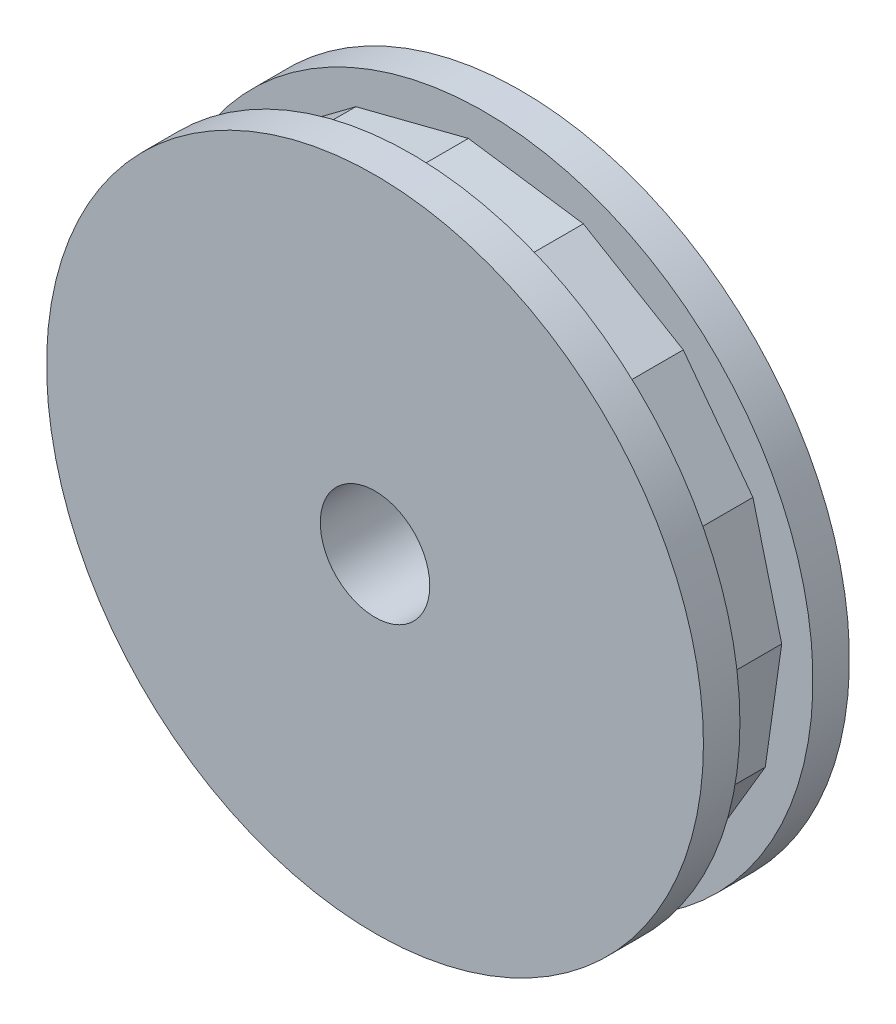
ISO-10303-21;
HEADER;
FILE_DESCRIPTION(('STEP AP214'),'2;1');
FILE_NAME('part.step','',(''),(''),'','','');
FILE_SCHEMA(('AUTOMOTIVE_DESIGN { 1 0 10303 214 1 1 1 1 }'));
ENDSEC;
DATA;
#1=APPLICATION_CONTEXT('core data for automotive mechanical design processes');
#2=APPLICATION_PROTOCOL_DEFINITION('international standard','automotive_design',2000,#1);
#3=PRODUCT_CONTEXT('',#1,'mechanical');
#4=PRODUCT('Part','Part','',(#3));
#5=PRODUCT_RELATED_PRODUCT_CATEGORY('part','',(#4));
#6=PRODUCT_DEFINITION_FORMATION('','',#4);
#7=PRODUCT_DEFINITION_CONTEXT('part definition',#1,'design');
#8=PRODUCT_DEFINITION('design','',#6,#7);
#9=PRODUCT_DEFINITION_SHAPE('','',#8);
#10=(LENGTH_UNIT() NAMED_UNIT(*) SI_UNIT(.MILLI.,.METRE.));
#11=(NAMED_UNIT(*) PLANE_ANGLE_UNIT() SI_UNIT($,.RADIAN.));
#12=(NAMED_UNIT(*) SI_UNIT($,.STERADIAN.) SOLID_ANGLE_UNIT());
#13=UNCERTAINTY_MEASURE_WITH_UNIT(LENGTH_MEASURE(1.E-05),#10,'distance_accuracy_value','');
#14=(GEOMETRIC_REPRESENTATION_CONTEXT(3) GLOBAL_UNCERTAINTY_ASSIGNED_CONTEXT((#13)) GLOBAL_UNIT_ASSIGNED_CONTEXT((#10,
#11,#12)) REPRESENTATION_CONTEXT('',''));
#15=CARTESIAN_POINT('',(0.,0.,0.));
#16=DIRECTION('',(0.,0.,1.));
#17=DIRECTION('',(1.,0.,0.));
#18=AXIS2_PLACEMENT_3D('',#15,#16,#17);
#19=CARTESIAN_POINT('',(7.69378013309483,-2.70887053529237,2.));
#20=DIRECTION('',(-0.98990912499885,0.141703649367303,0.));
#21=DIRECTION('',(-0.141703649367303,-0.98990912499885,0.));
#22=AXIS2_PLACEMENT_3D('',#19,#20,#21);
#23=PLANE('',#22);
#24=DIRECTION('',(0.141703649367303,0.98990912499885,0.));
#25=VECTOR('',#24,1.);
#26=CARTESIAN_POINT('',(7.69378013309483,-2.70887053529237,0.));
#27=LINE('',#26,#25);
#28=CARTESIAN_POINT('',(7.69378013309483,-2.70887053529237,0.));
#29=VERTEX_POINT('',#28);
#30=CARTESIAN_POINT('',(8.14476586688662,0.441612145415544,0.));
#31=VERTEX_POINT('',#30);
#32=EDGE_CURVE('E169',#29,#31,#27,.T.);
#33=ORIENTED_EDGE('',*,*,#32,.T.);
#34=DIRECTION('',(0.,0.,-1.));
#35=VECTOR('',#34,1.);
#36=CARTESIAN_POINT('',(8.14476586688662,0.441612145415544,2.));
#37=LINE('',#36,#35);
#38=CARTESIAN_POINT('',(8.14476586688662,0.441612145415544,2.));
#39=VERTEX_POINT('',#38);
#40=EDGE_CURVE('E11',#39,#31,#37,.T.);
#41=ORIENTED_EDGE('',*,*,#40,.F.);
#42=DIRECTION('',(0.141703649367303,0.98990912499885,0.));
#43=VECTOR('',#42,1.);
#44=CARTESIAN_POINT('',(7.69378013309483,-2.70887053529237,2.));
#45=LINE('',#44,#43);
#46=CARTESIAN_POINT('',(7.69378013309483,-2.70887053529237,2.));
#47=VERTEX_POINT('',#46);
#48=EDGE_CURVE('E145',#47,#39,#45,.T.);
#49=ORIENTED_EDGE('',*,*,#48,.F.);
#50=DIRECTION('',(0.,0.,-1.));
#51=VECTOR('',#50,1.);
#52=CARTESIAN_POINT('',(7.69378013309483,-2.70887053529237,2.));
#53=LINE('',#52,#51);
#54=EDGE_CURVE('E148',#47,#29,#53,.T.);
#55=ORIENTED_EDGE('',*,*,#54,.T.);
#56=EDGE_LOOP('',(#33,#41,#49,#55));
#57=FACE_BOUND('',#56,.T.);
#58=ADVANCED_FACE('F35',(#57),#23,.F.);
#59=CARTESIAN_POINT('',(8.14476586688662,0.441612145415544,2.));
#60=DIRECTION('',(-0.968784418551133,-0.247904720351476,0.));
#61=DIRECTION('',(0.247904720351476,-0.968784418551133,0.));
#62=AXIS2_PLACEMENT_3D('',#59,#60,#61);
#63=PLANE('',#62);
#64=DIRECTION('',(-0.247904720351476,0.968784418551133,0.));
#65=VECTOR('',#64,1.);
#66=CARTESIAN_POINT('',(8.14476586688662,0.441612145415544,0.));
#67=LINE('',#66,#65);
#68=CARTESIAN_POINT('',(7.35578482993136,3.52486338020802,0.));
#69=VERTEX_POINT('',#68);
#70=EDGE_CURVE('E171',#31,#69,#67,.T.);
#71=ORIENTED_EDGE('',*,*,#70,.T.);
#72=DIRECTION('',(0.,0.,-1.));
#73=VECTOR('',#72,1.);
#74=CARTESIAN_POINT('',(7.35578482993136,3.52486338020802,2.));
#75=LINE('',#74,#73);
#76=CARTESIAN_POINT('',(7.35578482993136,3.52486338020802,2.));
#77=VERTEX_POINT('',#76);
#78=EDGE_CURVE('E43',#77,#69,#75,.T.);
#79=ORIENTED_EDGE('',*,*,#78,.F.);
#80=DIRECTION('',(-0.247904720351476,0.968784418551133,0.));
#81=VECTOR('',#80,1.);
#82=CARTESIAN_POINT('',(8.14476586688662,0.441612145415544,2.));
#83=LINE('',#82,#81);
#84=EDGE_CURVE('E152',#39,#77,#83,.T.);
#85=ORIENTED_EDGE('',*,*,#84,.F.);
#86=ORIENTED_EDGE('',*,*,#40,.T.);
#87=EDGE_LOOP('',(#71,#79,#85,#86));
#88=FACE_BOUND('',#87,.T.);
#89=ADVANCED_FACE('F257',(#88),#63,.F.);
#90=CARTESIAN_POINT('',(7.35578482993136,3.52486338020802,2.));
#91=DIRECTION('',(-0.800171066431629,-0.599771843658628,0.));
#92=DIRECTION('',(0.599771843658628,-0.800171066431629,0.));
#93=AXIS2_PLACEMENT_3D('',#90,#91,#92);
#94=PLANE('',#93);
#95=DIRECTION('',(-0.599771843658628,0.800171066431629,0.));
#96=VECTOR('',#95,1.);
#97=CARTESIAN_POINT('',(7.35578482993136,3.52486338020802,0.));
#98=LINE('',#97,#96);
#99=CARTESIAN_POINT('',(5.44695223297458,6.07148611832994,0.));
#100=VERTEX_POINT('',#99);
#101=EDGE_CURVE('E175',#69,#100,#98,.T.);
#102=ORIENTED_EDGE('',*,*,#101,.T.);
#103=DIRECTION('',(0.,0.,-1.));
#104=VECTOR('',#103,1.);
#105=CARTESIAN_POINT('',(5.44695223297458,6.07148611832994,2.));
#106=LINE('',#105,#104);
#107=CARTESIAN_POINT('',(5.44695223297458,6.07148611832994,2.));
#108=VERTEX_POINT('',#107);
#109=EDGE_CURVE('E248',#108,#100,#106,.T.);
#110=ORIENTED_EDGE('',*,*,#109,.F.);
#111=DIRECTION('',(-0.599771843658628,0.800171066431629,0.));
#112=VECTOR('',#111,1.);
#113=CARTESIAN_POINT('',(7.35578482993136,3.52486338020802,2.));
#114=LINE('',#113,#112);
#115=EDGE_CURVE('E255',#77,#108,#114,.T.);
#116=ORIENTED_EDGE('',*,*,#115,.F.);
#117=ORIENTED_EDGE('',*,*,#78,.T.);
#118=EDGE_LOOP('',(#102,#110,#116,#117));
#119=FACE_BOUND('',#118,.T.);
#120=ADVANCED_FACE('F253',(#119),#94,.F.);
#121=CARTESIAN_POINT('',(5.44695223297458,6.07148611832994,2.));
#122=DIRECTION('',(-0.509738923016689,-0.860329140714056,0.));
#123=DIRECTION('',(0.860329140714056,-0.509738923016689,0.));
#124=AXIS2_PLACEMENT_3D('',#121,#122,#123);
#125=PLANE('',#124);
#126=DIRECTION('',(-0.860329140714056,0.50973892301669,0.));
#127=VECTOR('',#126,1.);
#128=CARTESIAN_POINT('',(5.44695223297458,6.07148611832994,0.));
#129=LINE('',#128,#127);
#130=CARTESIAN_POINT('',(2.70887053529236,7.69378013309484,0.));
#131=VERTEX_POINT('',#130);
#132=EDGE_CURVE('E178',#100,#131,#129,.T.);
#133=ORIENTED_EDGE('',*,*,#132,.T.);
#134=DIRECTION('',(0.,0.,-1.));
#135=VECTOR('',#134,1.);
#136=CARTESIAN_POINT('',(2.70887053529236,7.69378013309484,2.));
#137=LINE('',#136,#135);
#138=CARTESIAN_POINT('',(2.70887053529236,7.69378013309484,2.));
#139=VERTEX_POINT('',#138);
#140=EDGE_CURVE('E245',#139,#131,#137,.T.);
#141=ORIENTED_EDGE('',*,*,#140,.F.);
#142=DIRECTION('',(-0.860329140714056,0.50973892301669,0.));
#143=VECTOR('',#142,1.);
#144=CARTESIAN_POINT('',(5.44695223297458,6.07148611832994,2.));
#145=LINE('',#144,#143);
#146=EDGE_CURVE('E273',#108,#139,#145,.T.);
#147=ORIENTED_EDGE('',*,*,#146,.F.);
#148=ORIENTED_EDGE('',*,*,#109,.T.);
#149=EDGE_LOOP('',(#133,#141,#147,#148));
#150=FACE_BOUND('',#149,.T.);
#151=ADVANCED_FACE('F262',(#150),#125,.F.);
#152=CARTESIAN_POINT('',(2.70887053529236,7.69378013309484,2.));
#153=DIRECTION('',(-0.141703649367303,-0.98990912499885,0.));
#154=DIRECTION('',(0.98990912499885,-0.141703649367303,0.));
#155=AXIS2_PLACEMENT_3D('',#152,#153,#154);
#156=PLANE('',#155);
#157=DIRECTION('',(-0.98990912499885,0.141703649367303,0.));
#158=VECTOR('',#157,1.);
#159=CARTESIAN_POINT('',(2.70887053529236,7.69378013309484,0.));
#160=LINE('',#159,#158);
#161=CARTESIAN_POINT('',(-0.441612145415556,8.14476586688663,0.));
#162=VERTEX_POINT('',#161);
#163=EDGE_CURVE('E181',#131,#162,#160,.T.);
#164=ORIENTED_EDGE('',*,*,#163,.T.);
#165=DIRECTION('',(0.,0.,-1.));
#166=VECTOR('',#165,1.);
#167=CARTESIAN_POINT('',(-0.441612145415556,8.14476586688663,2.));
#168=LINE('',#167,#166);
#169=CARTESIAN_POINT('',(-0.441612145415556,8.14476586688663,2.));
#170=VERTEX_POINT('',#169);
#171=EDGE_CURVE('E242',#170,#162,#168,.T.);
#172=ORIENTED_EDGE('',*,*,#171,.F.);
#173=DIRECTION('',(-0.98990912499885,0.141703649367303,0.));
#174=VECTOR('',#173,1.);
#175=CARTESIAN_POINT('',(2.70887053529236,7.69378013309484,2.));
#176=LINE('',#175,#174);
#177=EDGE_CURVE('E268',#139,#170,#176,.T.);
#178=ORIENTED_EDGE('',*,*,#177,.F.);
#179=ORIENTED_EDGE('',*,*,#140,.T.);
#180=EDGE_LOOP('',(#164,#172,#178,#179));
#181=FACE_BOUND('',#180,.T.);
#182=ADVANCED_FACE('F266',(#181),#156,.F.);
#183=CARTESIAN_POINT('',(-0.441612145415556,8.14476586688663,2.));
#184=DIRECTION('',(0.247904720351476,-0.968784418551133,0.));
#185=DIRECTION('',(0.968784418551133,0.247904720351476,0.));
#186=AXIS2_PLACEMENT_3D('',#183,#184,#185);
#187=PLANE('',#186);
#188=DIRECTION('',(-0.968784418551133,-0.247904720351476,0.));
#189=VECTOR('',#188,1.);
#190=CARTESIAN_POINT('',(-0.441612145415556,8.14476586688663,0.));
#191=LINE('',#190,#189);
#192=CARTESIAN_POINT('',(-3.52486338020802,7.35578482993137,0.));
#193=VERTEX_POINT('',#192);
#194=EDGE_CURVE('E184',#162,#193,#191,.T.);
#195=ORIENTED_EDGE('',*,*,#194,.T.);
#196=DIRECTION('',(0.,0.,-1.));
#197=VECTOR('',#196,1.);
#198=CARTESIAN_POINT('',(-3.52486338020802,7.35578482993137,2.));
#199=LINE('',#198,#197);
#200=CARTESIAN_POINT('',(-3.52486338020802,7.35578482993137,2.));
#201=VERTEX_POINT('',#200);
#202=EDGE_CURVE('E239',#201,#193,#199,.T.);
#203=ORIENTED_EDGE('',*,*,#202,.F.);
#204=DIRECTION('',(-0.968784418551133,-0.247904720351476,0.));
#205=VECTOR('',#204,1.);
#206=CARTESIAN_POINT('',(-0.441612145415556,8.14476586688663,2.));
#207=LINE('',#206,#205);
#208=EDGE_CURVE('E272',#170,#201,#207,.T.);
#209=ORIENTED_EDGE('',*,*,#208,.F.);
#210=ORIENTED_EDGE('',*,*,#171,.T.);
#211=EDGE_LOOP('',(#195,#203,#209,#210));
#212=FACE_BOUND('',#211,.T.);
#213=ADVANCED_FACE('F327',(#212),#187,.F.);
#214=CARTESIAN_POINT('',(-3.52486338020802,7.35578482993137,2.));
#215=DIRECTION('',(0.599771843658628,-0.800171066431629,0.));
#216=DIRECTION('',(0.800171066431629,0.599771843658628,0.));
#217=AXIS2_PLACEMENT_3D('',#214,#215,#216);
#218=PLANE('',#217);
#219=DIRECTION('',(-0.800171066431629,-0.599771843658628,0.));
#220=VECTOR('',#219,1.);
#221=CARTESIAN_POINT('',(-3.52486338020802,7.35578482993137,0.));
#222=LINE('',#221,#220);
#223=CARTESIAN_POINT('',(-6.07148611832994,5.44695223297459,0.));
#224=VERTEX_POINT('',#223);
#225=EDGE_CURVE('E187',#193,#224,#222,.T.);
#226=ORIENTED_EDGE('',*,*,#225,.T.);
#227=DIRECTION('',(0.,0.,-1.));
#228=VECTOR('',#227,1.);
#229=CARTESIAN_POINT('',(-6.07148611832994,5.44695223297459,2.));
#230=LINE('',#229,#228);
#231=CARTESIAN_POINT('',(-6.07148611832994,5.44695223297459,2.));
#232=VERTEX_POINT('',#231);
#233=EDGE_CURVE('E236',#232,#224,#230,.T.);
#234=ORIENTED_EDGE('',*,*,#233,.F.);
#235=DIRECTION('',(-0.800171066431629,-0.599771843658628,0.));
#236=VECTOR('',#235,1.);
#237=CARTESIAN_POINT('',(-3.52486338020802,7.35578482993137,2.));
#238=LINE('',#237,#236);
#239=EDGE_CURVE('E280',#201,#232,#238,.T.);
#240=ORIENTED_EDGE('',*,*,#239,.F.);
#241=ORIENTED_EDGE('',*,*,#202,.T.);
#242=EDGE_LOOP('',(#226,#234,#240,#241));
#243=FACE_BOUND('',#242,.T.);
#244=ADVANCED_FACE('F330',(#243),#218,.F.);
#245=CARTESIAN_POINT('',(-6.07148611832994,5.44695223297459,2.));
#246=DIRECTION('',(0.860329140714056,-0.50973892301669,0.));
#247=DIRECTION('',(0.50973892301669,0.860329140714056,0.));
#248=AXIS2_PLACEMENT_3D('',#245,#246,#247);
#249=PLANE('',#248);
#250=DIRECTION('',(-0.50973892301669,-0.860329140714056,0.));
#251=VECTOR('',#250,1.);
#252=CARTESIAN_POINT('',(-6.07148611832994,5.44695223297459,0.));
#253=LINE('',#252,#251);
#254=CARTESIAN_POINT('',(-7.69378013309484,2.70887053529237,0.));
#255=VERTEX_POINT('',#254);
#256=EDGE_CURVE('E190',#224,#255,#253,.T.);
#257=ORIENTED_EDGE('',*,*,#256,.T.);
#258=DIRECTION('',(0.,0.,-1.));
#259=VECTOR('',#258,1.);
#260=CARTESIAN_POINT('',(-7.69378013309484,2.70887053529237,2.));
#261=LINE('',#260,#259);
#262=CARTESIAN_POINT('',(-7.69378013309484,2.70887053529237,2.));
#263=VERTEX_POINT('',#262);
#264=EDGE_CURVE('E233',#263,#255,#261,.T.);
#265=ORIENTED_EDGE('',*,*,#264,.F.);
#266=DIRECTION('',(-0.50973892301669,-0.860329140714056,0.));
#267=VECTOR('',#266,1.);
#268=CARTESIAN_POINT('',(-6.07148611832994,5.44695223297459,2.));
#269=LINE('',#268,#267);
#270=EDGE_CURVE('E283',#232,#263,#269,.T.);
#271=ORIENTED_EDGE('',*,*,#270,.F.);
#272=ORIENTED_EDGE('',*,*,#233,.T.);
#273=EDGE_LOOP('',(#257,#265,#271,#272));
#274=FACE_BOUND('',#273,.T.);
#275=ADVANCED_FACE('F334',(#274),#249,.F.);
#276=CARTESIAN_POINT('',(-7.69378013309484,2.70887053529237,2.));
#277=DIRECTION('',(0.98990912499885,-0.141703649367303,0.));
#278=DIRECTION('',(0.141703649367303,0.98990912499885,0.));
#279=AXIS2_PLACEMENT_3D('',#276,#277,#278);
#280=PLANE('',#279);
#281=DIRECTION('',(-0.141703649367303,-0.98990912499885,0.));
#282=VECTOR('',#281,1.);
#283=CARTESIAN_POINT('',(-7.69378013309484,2.70887053529237,0.));
#284=LINE('',#283,#282);
#285=CARTESIAN_POINT('',(-8.14476586688663,-0.441612145415538,0.));
#286=VERTEX_POINT('',#285);
#287=EDGE_CURVE('E193',#255,#286,#284,.T.);
#288=ORIENTED_EDGE('',*,*,#287,.T.);
#289=DIRECTION('',(0.,0.,-1.));
#290=VECTOR('',#289,1.);
#291=CARTESIAN_POINT('',(-8.14476586688663,-0.441612145415538,2.));
#292=LINE('',#291,#290);
#293=CARTESIAN_POINT('',(-8.14476586688663,-0.441612145415538,2.));
#294=VERTEX_POINT('',#293);
#295=EDGE_CURVE('E230',#294,#286,#292,.T.);
#296=ORIENTED_EDGE('',*,*,#295,.F.);
#297=DIRECTION('',(-0.141703649367303,-0.98990912499885,0.));
#298=VECTOR('',#297,1.);
#299=CARTESIAN_POINT('',(-7.69378013309484,2.70887053529237,2.));
#300=LINE('',#299,#298);
#301=EDGE_CURVE('E286',#263,#294,#300,.T.);
#302=ORIENTED_EDGE('',*,*,#301,.F.);
#303=ORIENTED_EDGE('',*,*,#264,.T.);
#304=EDGE_LOOP('',(#288,#296,#302,#303));
#305=FACE_BOUND('',#304,.T.);
#306=ADVANCED_FACE('F338',(#305),#280,.F.);
#307=CARTESIAN_POINT('',(-8.14476586688663,-0.441612145415538,2.));
#308=DIRECTION('',(0.968784418551133,0.247904720351475,0.));
#309=DIRECTION('',(-0.247904720351475,0.968784418551133,0.));
#310=AXIS2_PLACEMENT_3D('',#307,#308,#309);
#311=PLANE('',#310);
#312=DIRECTION('',(0.247904720351475,-0.968784418551133,0.));
#313=VECTOR('',#312,1.);
#314=CARTESIAN_POINT('',(-8.14476586688663,-0.441612145415538,0.));
#315=LINE('',#314,#313);
#316=CARTESIAN_POINT('',(-7.35578482993137,-3.52486338020802,0.));
#317=VERTEX_POINT('',#316);
#318=EDGE_CURVE('E196',#286,#317,#315,.T.);
#319=ORIENTED_EDGE('',*,*,#318,.T.);
#320=DIRECTION('',(0.,0.,-1.));
#321=VECTOR('',#320,1.);
#322=CARTESIAN_POINT('',(-7.35578482993137,-3.52486338020802,2.));
#323=LINE('',#322,#321);
#324=CARTESIAN_POINT('',(-7.35578482993137,-3.52486338020802,2.));
#325=VERTEX_POINT('',#324);
#326=EDGE_CURVE('E227',#325,#317,#323,.T.);
#327=ORIENTED_EDGE('',*,*,#326,.F.);
#328=DIRECTION('',(0.247904720351475,-0.968784418551133,0.));
#329=VECTOR('',#328,1.);
#330=CARTESIAN_POINT('',(-8.14476586688663,-0.441612145415538,2.));
#331=LINE('',#330,#329);
#332=EDGE_CURVE('E289',#294,#325,#331,.T.);
#333=ORIENTED_EDGE('',*,*,#332,.F.);
#334=ORIENTED_EDGE('',*,*,#295,.T.);
#335=EDGE_LOOP('',(#319,#327,#333,#334));
#336=FACE_BOUND('',#335,.T.);
#337=ADVANCED_FACE('F342',(#336),#311,.F.);
#338=CARTESIAN_POINT('',(-7.35578482993137,-3.52486338020802,2.));
#339=DIRECTION('',(0.800171066431629,0.599771843658628,0.));
#340=DIRECTION('',(-0.599771843658628,0.800171066431629,0.));
#341=AXIS2_PLACEMENT_3D('',#338,#339,#340);
#342=PLANE('',#341);
#343=DIRECTION('',(0.599771843658628,-0.800171066431629,0.));
#344=VECTOR('',#343,1.);
#345=CARTESIAN_POINT('',(-7.35578482993137,-3.52486338020802,0.));
#346=LINE('',#345,#344);
#347=CARTESIAN_POINT('',(-5.44695223297458,-6.07148611832994,0.));
#348=VERTEX_POINT('',#347);
#349=EDGE_CURVE('E199',#317,#348,#346,.T.);
#350=ORIENTED_EDGE('',*,*,#349,.T.);
#351=DIRECTION('',(0.,0.,-1.));
#352=VECTOR('',#351,1.);
#353=CARTESIAN_POINT('',(-5.44695223297458,-6.07148611832994,2.));
#354=LINE('',#353,#352);
#355=CARTESIAN_POINT('',(-5.44695223297458,-6.07148611832994,2.));
#356=VERTEX_POINT('',#355);
#357=EDGE_CURVE('E224',#356,#348,#354,.T.);
#358=ORIENTED_EDGE('',*,*,#357,.F.);
#359=DIRECTION('',(0.599771843658628,-0.800171066431629,0.));
#360=VECTOR('',#359,1.);
#361=CARTESIAN_POINT('',(-7.35578482993137,-3.52486338020802,2.));
#362=LINE('',#361,#360);
#363=EDGE_CURVE('E292',#325,#356,#362,.T.);
#364=ORIENTED_EDGE('',*,*,#363,.F.);
#365=ORIENTED_EDGE('',*,*,#326,.T.);
#366=EDGE_LOOP('',(#350,#358,#364,#365));
#367=FACE_BOUND('',#366,.T.);
#368=ADVANCED_FACE('F346',(#367),#342,.F.);
#369=CARTESIAN_POINT('',(-5.44695223297458,-6.07148611832994,2.));
#370=DIRECTION('',(0.509738923016689,0.860329140714056,0.));
#371=DIRECTION('',(-0.860329140714056,0.509738923016689,0.));
#372=AXIS2_PLACEMENT_3D('',#369,#370,#371);
#373=PLANE('',#372);
#374=DIRECTION('',(0.860329140714056,-0.509738923016689,0.));
#375=VECTOR('',#374,1.);
#376=CARTESIAN_POINT('',(-5.44695223297458,-6.07148611832994,0.));
#377=LINE('',#376,#375);
#378=CARTESIAN_POINT('',(-2.70887053529237,-7.69378013309483,0.));
#379=VERTEX_POINT('',#378);
#380=EDGE_CURVE('E202',#348,#379,#377,.T.);
#381=ORIENTED_EDGE('',*,*,#380,.T.);
#382=DIRECTION('',(0.,0.,-1.));
#383=VECTOR('',#382,1.);
#384=CARTESIAN_POINT('',(-2.70887053529237,-7.69378013309483,2.));
#385=LINE('',#384,#383);
#386=CARTESIAN_POINT('',(-2.70887053529237,-7.69378013309483,2.));
#387=VERTEX_POINT('',#386);
#388=EDGE_CURVE('E221',#387,#379,#385,.T.);
#389=ORIENTED_EDGE('',*,*,#388,.F.);
#390=DIRECTION('',(0.860329140714056,-0.509738923016689,0.));
#391=VECTOR('',#390,1.);
#392=CARTESIAN_POINT('',(-5.44695223297458,-6.07148611832994,2.));
#393=LINE('',#392,#391);
#394=EDGE_CURVE('E295',#356,#387,#393,.T.);
#395=ORIENTED_EDGE('',*,*,#394,.F.);
#396=ORIENTED_EDGE('',*,*,#357,.T.);
#397=EDGE_LOOP('',(#381,#389,#395,#396));
#398=FACE_BOUND('',#397,.T.);
#399=ADVANCED_FACE('F350',(#398),#373,.F.);
#400=CARTESIAN_POINT('',(-2.70887053529237,-7.69378013309483,2.));
#401=DIRECTION('',(0.141703649367303,0.98990912499885,0.));
#402=DIRECTION('',(-0.98990912499885,0.141703649367303,0.));
#403=AXIS2_PLACEMENT_3D('',#400,#401,#402);
#404=PLANE('',#403);
#405=DIRECTION('',(0.98990912499885,-0.141703649367303,0.));
#406=VECTOR('',#405,1.);
#407=CARTESIAN_POINT('',(-2.70887053529237,-7.69378013309483,0.));
#408=LINE('',#407,#406);
#409=CARTESIAN_POINT('',(0.441612145415548,-8.14476586688662,0.));
#410=VERTEX_POINT('',#409);
#411=EDGE_CURVE('E205',#379,#410,#408,.T.);
#412=ORIENTED_EDGE('',*,*,#411,.T.);
#413=DIRECTION('',(0.,0.,-1.));
#414=VECTOR('',#413,1.);
#415=CARTESIAN_POINT('',(0.441612145415548,-8.14476586688662,2.));
#416=LINE('',#415,#414);
#417=CARTESIAN_POINT('',(0.441612145415548,-8.14476586688662,2.));
#418=VERTEX_POINT('',#417);
#419=EDGE_CURVE('E218',#418,#410,#416,.T.);
#420=ORIENTED_EDGE('',*,*,#419,.F.);
#421=DIRECTION('',(0.98990912499885,-0.141703649367303,0.));
#422=VECTOR('',#421,1.);
#423=CARTESIAN_POINT('',(-2.70887053529237,-7.69378013309483,2.));
#424=LINE('',#423,#422);
#425=EDGE_CURVE('E298',#387,#418,#424,.T.);
#426=ORIENTED_EDGE('',*,*,#425,.F.);
#427=ORIENTED_EDGE('',*,*,#388,.T.);
#428=EDGE_LOOP('',(#412,#420,#426,#427));
#429=FACE_BOUND('',#428,.T.);
#430=ADVANCED_FACE('F312',(#429),#404,.F.);
#431=CARTESIAN_POINT('',(0.441612145415548,-8.14476586688662,2.));
#432=DIRECTION('',(-0.247904720351475,0.968784418551133,0.));
#433=DIRECTION('',(-0.968784418551133,-0.247904720351475,0.));
#434=AXIS2_PLACEMENT_3D('',#431,#432,#433);
#435=PLANE('',#434);
#436=DIRECTION('',(0.968784418551133,0.247904720351475,0.));
#437=VECTOR('',#436,1.);
#438=CARTESIAN_POINT('',(0.441612145415548,-8.14476586688662,0.));
#439=LINE('',#438,#437);
#440=CARTESIAN_POINT('',(3.52486338020802,-7.35578482993137,0.));
#441=VERTEX_POINT('',#440);
#442=EDGE_CURVE('E208',#410,#441,#439,.T.);
#443=ORIENTED_EDGE('',*,*,#442,.T.);
#444=DIRECTION('',(0.,0.,-1.));
#445=VECTOR('',#444,1.);
#446=CARTESIAN_POINT('',(3.52486338020802,-7.35578482993137,2.));
#447=LINE('',#446,#445);
#448=CARTESIAN_POINT('',(3.52486338020802,-7.35578482993137,2.));
#449=VERTEX_POINT('',#448);
#450=EDGE_CURVE('E215',#449,#441,#447,.T.);
#451=ORIENTED_EDGE('',*,*,#450,.F.);
#452=DIRECTION('',(0.968784418551133,0.247904720351475,0.));
#453=VECTOR('',#452,1.);
#454=CARTESIAN_POINT('',(0.441612145415548,-8.14476586688662,2.));
#455=LINE('',#454,#453);
#456=EDGE_CURVE('E165',#418,#449,#455,.T.);
#457=ORIENTED_EDGE('',*,*,#456,.F.);
#458=ORIENTED_EDGE('',*,*,#419,.T.);
#459=EDGE_LOOP('',(#443,#451,#457,#458));
#460=FACE_BOUND('',#459,.T.);
#461=ADVANCED_FACE('F303',(#460),#435,.F.);
#462=CARTESIAN_POINT('',(3.52486338020802,-7.35578482993137,2.));
#463=DIRECTION('',(-0.599771843658628,0.800171066431629,0.));
#464=DIRECTION('',(-0.800171066431629,-0.599771843658628,0.));
#465=AXIS2_PLACEMENT_3D('',#462,#463,#464);
#466=PLANE('',#465);
#467=DIRECTION('',(0.800171066431629,0.599771843658628,0.));
#468=VECTOR('',#467,1.);
#469=CARTESIAN_POINT('',(3.52486338020802,-7.35578482993137,0.));
#470=LINE('',#469,#468);
#471=CARTESIAN_POINT('',(6.07148611832993,-5.44695223297459,0.));
#472=VERTEX_POINT('',#471);
#473=EDGE_CURVE('E211',#441,#472,#470,.T.);
#474=ORIENTED_EDGE('',*,*,#473,.T.);
#475=DIRECTION('',(0.,0.,-1.));
#476=VECTOR('',#475,1.);
#477=CARTESIAN_POINT('',(6.07148611832993,-5.44695223297459,2.));
#478=LINE('',#477,#476);
#479=CARTESIAN_POINT('',(6.07148611832993,-5.44695223297459,2.));
#480=VERTEX_POINT('',#479);
#481=EDGE_CURVE('E50',#480,#472,#478,.T.);
#482=ORIENTED_EDGE('',*,*,#481,.F.);
#483=DIRECTION('',(0.800171066431629,0.599771843658628,0.));
#484=VECTOR('',#483,1.);
#485=CARTESIAN_POINT('',(3.52486338020802,-7.35578482993137,2.));
#486=LINE('',#485,#484);
#487=EDGE_CURVE('E163',#449,#480,#486,.T.);
#488=ORIENTED_EDGE('',*,*,#487,.F.);
#489=ORIENTED_EDGE('',*,*,#450,.T.);
#490=EDGE_LOOP('',(#474,#482,#488,#489));
#491=FACE_BOUND('',#490,.T.);
#492=ADVANCED_FACE('F304',(#491),#466,.F.);
#493=CARTESIAN_POINT('',(6.07148611832993,-5.44695223297459,2.));
#494=DIRECTION('',(-0.860329140714056,0.50973892301669,0.));
#495=DIRECTION('',(-0.50973892301669,-0.860329140714056,0.));
#496=AXIS2_PLACEMENT_3D('',#493,#494,#495);
#497=PLANE('',#496);
#498=DIRECTION('',(0.50973892301669,0.860329140714056,0.));
#499=VECTOR('',#498,1.);
#500=CARTESIAN_POINT('',(6.07148611832993,-5.44695223297459,0.));
#501=LINE('',#500,#499);
#502=EDGE_CURVE('E153',#472,#29,#501,.T.);
#503=ORIENTED_EDGE('',*,*,#502,.T.);
#504=ORIENTED_EDGE('',*,*,#54,.F.);
#505=DIRECTION('',(0.50973892301669,0.860329140714056,0.));
#506=VECTOR('',#505,1.);
#507=CARTESIAN_POINT('',(6.07148611832993,-5.44695223297459,2.));
#508=LINE('',#507,#506);
#509=EDGE_CURVE('E158',#480,#47,#508,.T.);
#510=ORIENTED_EDGE('',*,*,#509,.F.);
#511=ORIENTED_EDGE('',*,*,#481,.T.);
#512=EDGE_LOOP('',(#503,#504,#510,#511));
#513=FACE_BOUND('',#512,.T.);
#514=ADVANCED_FACE('F157',(#513),#497,.F.);
#515=CARTESIAN_POINT('',(0.,0.,0.));
#516=DIRECTION('',(0.,0.,-1.));
#517=DIRECTION('',(-1.,0.,0.));
#518=AXIS2_PLACEMENT_3D('',#515,#516,#517);
#519=PLANE('',#518);
#520=CARTESIAN_POINT('',(0.,0.,0.));
#521=DIRECTION('',(0.,0.,-1.));
#522=DIRECTION('',(-1.,0.,0.));
#523=AXIS2_PLACEMENT_3D('',#520,#521,#522);
#524=CIRCLE('',#523,9.);
#525=CARTESIAN_POINT('',(-9.,0.,0.));
#526=VERTEX_POINT('',#525);
#527=EDGE_CURVE('E452',#526,#526,#524,.T.);
#528=ORIENTED_EDGE('',*,*,#527,.F.);
#529=EDGE_LOOP('',(#528));
#530=FACE_BOUND('',#529,.T.);
#531=ORIENTED_EDGE('',*,*,#70,.F.);
#532=ORIENTED_EDGE('',*,*,#32,.F.);
#533=ORIENTED_EDGE('',*,*,#502,.F.);
#534=ORIENTED_EDGE('',*,*,#473,.F.);
#535=ORIENTED_EDGE('',*,*,#442,.F.);
#536=ORIENTED_EDGE('',*,*,#411,.F.);
#537=ORIENTED_EDGE('',*,*,#380,.F.);
#538=ORIENTED_EDGE('',*,*,#349,.F.);
#539=ORIENTED_EDGE('',*,*,#318,.F.);
#540=ORIENTED_EDGE('',*,*,#287,.F.);
#541=ORIENTED_EDGE('',*,*,#256,.F.);
#542=ORIENTED_EDGE('',*,*,#225,.F.);
#543=ORIENTED_EDGE('',*,*,#194,.F.);
#544=ORIENTED_EDGE('',*,*,#163,.F.);
#545=ORIENTED_EDGE('',*,*,#132,.F.);
#546=ORIENTED_EDGE('',*,*,#101,.F.);
#547=EDGE_LOOP('',(#531,#532,#533,#534,#535,#536,#537,#538,#539,#540,#541,#542,#543,#544,#545,#546));
#548=FACE_BOUND('',#547,.T.);
#549=ADVANCED_FACE('F260',(#530,#548),#519,.F.);
#550=CARTESIAN_POINT('',(0.,0.,-1.));
#551=DIRECTION('',(0.,0.,1.));
#552=DIRECTION('',(1.,0.,0.));
#553=AXIS2_PLACEMENT_3D('',#550,#551,#552);
#554=CYLINDRICAL_SURFACE('',#553,9.);
#555=CARTESIAN_POINT('',(0.,0.,-1.));
#556=DIRECTION('',(0.,0.,-1.));
#557=DIRECTION('',(-1.,0.,0.));
#558=AXIS2_PLACEMENT_3D('',#555,#556,#557);
#559=CIRCLE('',#558,9.);
#560=CARTESIAN_POINT('',(-9.,0.,-1.));
#561=VERTEX_POINT('',#560);
#562=EDGE_CURVE('E172',#561,#561,#559,.T.);
#563=ORIENTED_EDGE('',*,*,#562,.F.);
#564=EDGE_LOOP('',(#563));
#565=FACE_BOUND('',#564,.T.);
#566=ORIENTED_EDGE('',*,*,#527,.T.);
#567=EDGE_LOOP('',(#566));
#568=FACE_BOUND('',#567,.T.);
#569=ADVANCED_FACE('F415',(#565,#568),#554,.T.);
#570=CARTESIAN_POINT('',(0.,0.,-1.));
#571=DIRECTION('',(0.,0.,-1.));
#572=DIRECTION('',(-1.,0.,0.));
#573=AXIS2_PLACEMENT_3D('',#570,#571,#572);
#574=PLANE('',#573);
#575=CARTESIAN_POINT('',(0.,0.,-1.));
#576=DIRECTION('',(0.,0.,1.));
#577=DIRECTION('',(1.,0.,0.));
#578=AXIS2_PLACEMENT_3D('',#575,#576,#577);
#579=CIRCLE('',#578,1.5);
#580=CARTESIAN_POINT('',(1.5,0.,-1.));
#581=VERTEX_POINT('',#580);
#582=EDGE_CURVE('E461',#581,#581,#579,.T.);
#583=ORIENTED_EDGE('',*,*,#582,.T.);
#584=EDGE_LOOP('',(#583));
#585=FACE_BOUND('',#584,.T.);
#586=ORIENTED_EDGE('',*,*,#562,.T.);
#587=EDGE_LOOP('',(#586));
#588=FACE_BOUND('',#587,.T.);
#589=ADVANCED_FACE('F393',(#585,#588),#574,.T.);
#590=CARTESIAN_POINT('',(0.,0.,2.));
#591=DIRECTION('',(0.,0.,1.));
#592=DIRECTION('',(1.,0.,0.));
#593=AXIS2_PLACEMENT_3D('',#590,#591,#592);
#594=PLANE('',#593);
#595=CARTESIAN_POINT('',(0.,0.,2.));
#596=DIRECTION('',(0.,0.,1.));
#597=DIRECTION('',(1.,0.,0.));
#598=AXIS2_PLACEMENT_3D('',#595,#596,#597);
#599=CIRCLE('',#598,9.);
#600=CARTESIAN_POINT('',(9.,0.,2.));
#601=VERTEX_POINT('',#600);
#602=EDGE_CURVE('E457',#601,#601,#599,.T.);
#603=ORIENTED_EDGE('',*,*,#602,.F.);
#604=EDGE_LOOP('',(#603));
#605=FACE_BOUND('',#604,.T.);
#606=ORIENTED_EDGE('',*,*,#509,.T.);
#607=ORIENTED_EDGE('',*,*,#48,.T.);
#608=ORIENTED_EDGE('',*,*,#84,.T.);
#609=ORIENTED_EDGE('',*,*,#115,.T.);
#610=ORIENTED_EDGE('',*,*,#146,.T.);
#611=ORIENTED_EDGE('',*,*,#177,.T.);
#612=ORIENTED_EDGE('',*,*,#208,.T.);
#613=ORIENTED_EDGE('',*,*,#239,.T.);
#614=ORIENTED_EDGE('',*,*,#270,.T.);
#615=ORIENTED_EDGE('',*,*,#301,.T.);
#616=ORIENTED_EDGE('',*,*,#332,.T.);
#617=ORIENTED_EDGE('',*,*,#363,.T.);
#618=ORIENTED_EDGE('',*,*,#394,.T.);
#619=ORIENTED_EDGE('',*,*,#425,.T.);
#620=ORIENTED_EDGE('',*,*,#456,.T.);
#621=ORIENTED_EDGE('',*,*,#487,.T.);
#622=EDGE_LOOP('',(#606,#607,#608,#609,#610,#611,#612,#613,#614,#615,#616,#617,#618,#619,#620,#621));
#623=FACE_BOUND('',#622,.T.);
#624=ADVANCED_FACE('F161',(#605,#623),#594,.F.);
#625=CARTESIAN_POINT('',(0.,0.,3.));
#626=DIRECTION('',(0.,0.,-1.));
#627=DIRECTION('',(-1.,0.,0.));
#628=AXIS2_PLACEMENT_3D('',#625,#626,#627);
#629=CYLINDRICAL_SURFACE('',#628,9.);
#630=CARTESIAN_POINT('',(0.,0.,3.));
#631=DIRECTION('',(0.,0.,1.));
#632=DIRECTION('',(1.,0.,0.));
#633=AXIS2_PLACEMENT_3D('',#630,#631,#632);
#634=CIRCLE('',#633,9.);
#635=CARTESIAN_POINT('',(9.,0.,3.));
#636=VERTEX_POINT('',#635);
#637=EDGE_CURVE('E453',#636,#636,#634,.T.);
#638=ORIENTED_EDGE('',*,*,#637,.F.);
#639=EDGE_LOOP('',(#638));
#640=FACE_BOUND('',#639,.T.);
#641=ORIENTED_EDGE('',*,*,#602,.T.);
#642=EDGE_LOOP('',(#641));
#643=FACE_BOUND('',#642,.T.);
#644=ADVANCED_FACE('F392',(#640,#643),#629,.T.);
#645=CARTESIAN_POINT('',(0.,0.,3.));
#646=DIRECTION('',(0.,0.,1.));
#647=DIRECTION('',(1.,0.,0.));
#648=AXIS2_PLACEMENT_3D('',#645,#646,#647);
#649=PLANE('',#648);
#650=CARTESIAN_POINT('',(0.,0.,3.));
#651=DIRECTION('',(0.,0.,1.));
#652=DIRECTION('',(1.,0.,0.));
#653=AXIS2_PLACEMENT_3D('',#650,#651,#652);
#654=CIRCLE('',#653,1.5);
#655=CARTESIAN_POINT('',(1.5,0.,3.));
#656=VERTEX_POINT('',#655);
#657=EDGE_CURVE('E463',#656,#656,#654,.T.);
#658=ORIENTED_EDGE('',*,*,#657,.F.);
#659=EDGE_LOOP('',(#658));
#660=FACE_BOUND('',#659,.T.);
#661=ORIENTED_EDGE('',*,*,#637,.T.);
#662=EDGE_LOOP('',(#661));
#663=FACE_BOUND('',#662,.T.);
#664=ADVANCED_FACE('F405',(#660,#663),#649,.T.);
#665=CARTESIAN_POINT('',(0.,0.,-1.));
#666=DIRECTION('',(0.,0.,1.));
#667=DIRECTION('',(1.,0.,0.));
#668=AXIS2_PLACEMENT_3D('',#665,#666,#667);
#669=CYLINDRICAL_SURFACE('',#668,1.5);
#670=ORIENTED_EDGE('',*,*,#582,.F.);
#671=EDGE_LOOP('',(#670));
#672=FACE_BOUND('',#671,.T.);
#673=ORIENTED_EDGE('',*,*,#657,.T.);
#674=EDGE_LOOP('',(#673));
#675=FACE_BOUND('',#674,.T.);
#676=ADVANCED_FACE('F425',(#672,#675),#669,.F.);
#677=CLOSED_SHELL('',(#58,#89,#120,#151,#182,#213,#244,#275,#306,#337,#368,#399,#430,#461,#492,
#514,#549,#569,#589,#624,#644,#664,#676));
#678=MANIFOLD_SOLID_BREP('B2',#677);
#679=ADVANCED_BREP_SHAPE_REPRESENTATION('',(#18,#678),#14);
#680=SHAPE_DEFINITION_REPRESENTATION(#9,#679);
ENDSEC;
END-ISO-10303-21;
